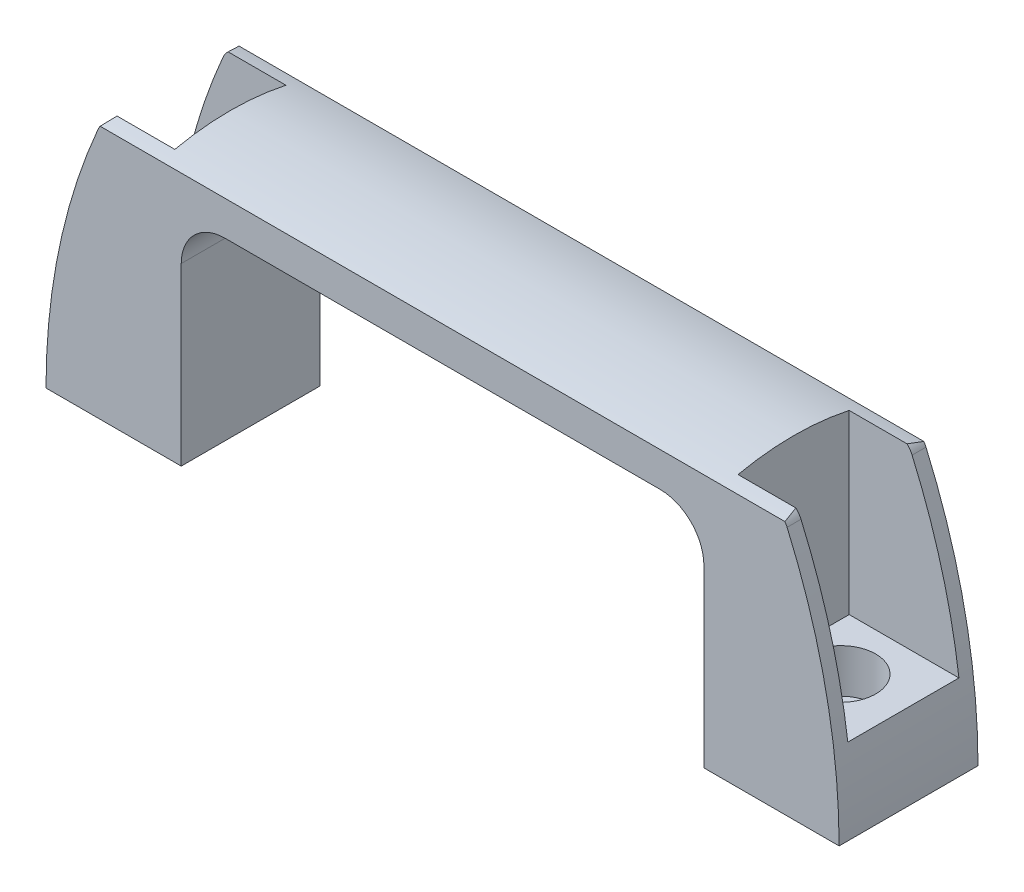
ISO-10303-21;
HEADER;
FILE_DESCRIPTION(('STEP AP214'),'2;1');
FILE_NAME('part.step','',(''),(''),'','','');
FILE_SCHEMA(('AUTOMOTIVE_DESIGN { 1 0 10303 214 1 1 1 1 }'));
ENDSEC;
DATA;
#1=APPLICATION_CONTEXT('core data for automotive mechanical design processes');
#2=APPLICATION_PROTOCOL_DEFINITION('international standard','automotive_design',2000,#1);
#3=PRODUCT_CONTEXT('',#1,'mechanical');
#4=PRODUCT('Part','Part','',(#3));
#5=PRODUCT_RELATED_PRODUCT_CATEGORY('part','',(#4));
#6=PRODUCT_DEFINITION_FORMATION('','',#4);
#7=PRODUCT_DEFINITION_CONTEXT('part definition',#1,'design');
#8=PRODUCT_DEFINITION('design','',#6,#7);
#9=PRODUCT_DEFINITION_SHAPE('','',#8);
#10=(LENGTH_UNIT() NAMED_UNIT(*) SI_UNIT(.MILLI.,.METRE.));
#11=(NAMED_UNIT(*) PLANE_ANGLE_UNIT() SI_UNIT($,.RADIAN.));
#12=(NAMED_UNIT(*) SI_UNIT($,.STERADIAN.) SOLID_ANGLE_UNIT());
#13=UNCERTAINTY_MEASURE_WITH_UNIT(LENGTH_MEASURE(1.E-05),#10,'distance_accuracy_value','');
#14=(GEOMETRIC_REPRESENTATION_CONTEXT(3) GLOBAL_UNCERTAINTY_ASSIGNED_CONTEXT((#13)) GLOBAL_UNIT_ASSIGNED_CONTEXT((#10,
#11,#12)) REPRESENTATION_CONTEXT('',''));
#15=CARTESIAN_POINT('',(0.,0.,0.));
#16=DIRECTION('',(0.,0.,1.));
#17=DIRECTION('',(1.,0.,0.));
#18=AXIS2_PLACEMENT_3D('',#15,#16,#17);
#19=CARTESIAN_POINT('',(87.25,5.,0.));
#20=DIRECTION('',(0.,1.,0.));
#21=DIRECTION('',(0.,0.,1.));
#22=AXIS2_PLACEMENT_3D('',#19,#20,#21);
#23=PLANE('',#22);
#24=CARTESIAN_POINT('',(90.,5.,0.));
#25=DIRECTION('',(0.,-1.,0.));
#26=DIRECTION('',(0.,0.,-1.));
#27=AXIS2_PLACEMENT_3D('',#24,#25,#26);
#28=CIRCLE('',#27,2.74999999999999);
#29=CARTESIAN_POINT('',(90.,5.,-2.74999999999999));
#30=VERTEX_POINT('',#29);
#31=EDGE_CURVE('E286',#30,#30,#28,.T.);
#32=ORIENTED_EDGE('',*,*,#31,.T.);
#33=EDGE_LOOP('',(#32));
#34=FACE_BOUND('',#33,.T.);
#35=CARTESIAN_POINT('',(90.,5.,0.));
#36=DIRECTION('',(0.,-1.,0.));
#37=DIRECTION('',(0.,0.,-1.));
#38=AXIS2_PLACEMENT_3D('',#35,#36,#37);
#39=CIRCLE('',#38,4.74999999999999);
#40=CARTESIAN_POINT('',(90.,5.,-4.74999999999999));
#41=VERTEX_POINT('',#40);
#42=EDGE_CURVE('E19',#41,#41,#39,.F.);
#43=ORIENTED_EDGE('',*,*,#42,.T.);
#44=EDGE_LOOP('',(#43));
#45=FACE_BOUND('',#44,.T.);
#46=ADVANCED_FACE('F16',(#34,#45),#23,.T.);
#47=CARTESIAN_POINT('',(-2.75,5.,0.));
#48=DIRECTION('',(0.,1.,0.));
#49=DIRECTION('',(0.,0.,1.));
#50=AXIS2_PLACEMENT_3D('',#47,#48,#49);
#51=PLANE('',#50);
#52=CARTESIAN_POINT('',(0.,5.,0.));
#53=DIRECTION('',(0.,-1.,0.));
#54=DIRECTION('',(0.,0.,-1.));
#55=AXIS2_PLACEMENT_3D('',#52,#53,#54);
#56=CIRCLE('',#55,2.75);
#57=CARTESIAN_POINT('',(0.,5.,-2.75));
#58=VERTEX_POINT('',#57);
#59=EDGE_CURVE('E288',#58,#58,#56,.T.);
#60=ORIENTED_EDGE('',*,*,#59,.T.);
#61=EDGE_LOOP('',(#60));
#62=FACE_BOUND('',#61,.T.);
#63=CARTESIAN_POINT('',(0.,5.,0.));
#64=DIRECTION('',(0.,-1.,0.));
#65=DIRECTION('',(0.,0.,-1.));
#66=AXIS2_PLACEMENT_3D('',#63,#64,#65);
#67=CIRCLE('',#66,4.75);
#68=CARTESIAN_POINT('',(0.,5.,-4.75));
#69=VERTEX_POINT('',#68);
#70=EDGE_CURVE('E283',#69,#69,#67,.F.);
#71=ORIENTED_EDGE('',*,*,#70,.T.);
#72=EDGE_LOOP('',(#71));
#73=FACE_BOUND('',#72,.T.);
#74=ADVANCED_FACE('F300',(#62,#73),#51,.T.);
#75=CARTESIAN_POINT('',(90.,11.,0.));
#76=DIRECTION('',(0.,-1.,0.));
#77=DIRECTION('',(0.,0.,-1.));
#78=AXIS2_PLACEMENT_3D('',#75,#76,#77);
#79=CYLINDRICAL_SURFACE('',#78,4.74999999999999);
#80=ORIENTED_EDGE('',*,*,#42,.F.);
#81=EDGE_LOOP('',(#80));
#82=FACE_BOUND('',#81,.T.);
#83=CARTESIAN_POINT('',(90.,11.,0.));
#84=DIRECTION('',(0.,-1.,0.));
#85=DIRECTION('',(0.,0.,-1.));
#86=AXIS2_PLACEMENT_3D('',#83,#84,#85);
#87=CIRCLE('',#86,4.74999999999999);
#88=CARTESIAN_POINT('',(90.,11.,-4.74999999999999));
#89=VERTEX_POINT('',#88);
#90=EDGE_CURVE('E280',#89,#89,#87,.T.);
#91=ORIENTED_EDGE('',*,*,#90,.F.);
#92=EDGE_LOOP('',(#91));
#93=FACE_BOUND('',#92,.T.);
#94=ADVANCED_FACE('F296',(#82,#93),#79,.F.);
#95=CARTESIAN_POINT('',(0.,11.,0.));
#96=DIRECTION('',(0.,-1.,0.));
#97=DIRECTION('',(0.,0.,-1.));
#98=AXIS2_PLACEMENT_3D('',#95,#96,#97);
#99=CYLINDRICAL_SURFACE('',#98,2.75);
#100=CARTESIAN_POINT('',(0.,0.,0.));
#101=DIRECTION('',(0.,-1.,0.));
#102=DIRECTION('',(0.,0.,-1.));
#103=AXIS2_PLACEMENT_3D('',#100,#101,#102);
#104=CIRCLE('',#103,2.75);
#105=CARTESIAN_POINT('',(0.,0.,-2.75));
#106=VERTEX_POINT('',#105);
#107=EDGE_CURVE('E276',#106,#106,#104,.T.);
#108=ORIENTED_EDGE('',*,*,#107,.T.);
#109=EDGE_LOOP('',(#108));
#110=FACE_BOUND('',#109,.T.);
#111=ORIENTED_EDGE('',*,*,#59,.F.);
#112=EDGE_LOOP('',(#111));
#113=FACE_BOUND('',#112,.T.);
#114=ADVANCED_FACE('F299',(#110,#113),#99,.F.);
#115=CARTESIAN_POINT('',(90.,11.,0.));
#116=DIRECTION('',(0.,-1.,0.));
#117=DIRECTION('',(0.,0.,-1.));
#118=AXIS2_PLACEMENT_3D('',#115,#116,#117);
#119=CYLINDRICAL_SURFACE('',#118,2.74999999999999);
#120=CARTESIAN_POINT('',(90.,0.,0.));
#121=DIRECTION('',(0.,-1.,0.));
#122=DIRECTION('',(0.,0.,-1.));
#123=AXIS2_PLACEMENT_3D('',#120,#121,#122);
#124=CIRCLE('',#123,2.74999999999999);
#125=CARTESIAN_POINT('',(90.,0.,-2.74999999999999));
#126=VERTEX_POINT('',#125);
#127=EDGE_CURVE('E271',#126,#126,#124,.T.);
#128=ORIENTED_EDGE('',*,*,#127,.T.);
#129=EDGE_LOOP('',(#128));
#130=FACE_BOUND('',#129,.T.);
#131=ORIENTED_EDGE('',*,*,#31,.F.);
#132=EDGE_LOOP('',(#131));
#133=FACE_BOUND('',#132,.T.);
#134=ADVANCED_FACE('F672',(#130,#133),#119,.F.);
#135=CARTESIAN_POINT('',(0.,11.,0.));
#136=DIRECTION('',(0.,-1.,0.));
#137=DIRECTION('',(0.,0.,-1.));
#138=AXIS2_PLACEMENT_3D('',#135,#136,#137);
#139=CYLINDRICAL_SURFACE('',#138,4.75);
#140=ORIENTED_EDGE('',*,*,#70,.F.);
#141=EDGE_LOOP('',(#140));
#142=FACE_BOUND('',#141,.T.);
#143=CARTESIAN_POINT('',(0.,11.,0.));
#144=DIRECTION('',(0.,-1.,0.));
#145=DIRECTION('',(0.,0.,-1.));
#146=AXIS2_PLACEMENT_3D('',#143,#144,#145);
#147=CIRCLE('',#146,4.75);
#148=CARTESIAN_POINT('',(0.,11.,-4.75));
#149=VERTEX_POINT('',#148);
#150=EDGE_CURVE('E266',#149,#149,#147,.T.);
#151=ORIENTED_EDGE('',*,*,#150,.F.);
#152=EDGE_LOOP('',(#151));
#153=FACE_BOUND('',#152,.T.);
#154=ADVANCED_FACE('F308',(#142,#153),#139,.F.);
#155=CARTESIAN_POINT('',(0.,11.,0.));
#156=DIRECTION('',(0.,1.,0.));
#157=DIRECTION('',(0.,0.,1.));
#158=AXIS2_PLACEMENT_3D('',#155,#156,#157);
#159=PLANE('',#158);
#160=ORIENTED_EDGE('',*,*,#90,.T.);
#161=EDGE_LOOP('',(#160));
#162=FACE_BOUND('',#161,.T.);
#163=DIRECTION('',(0.,0.,1.));
#164=VECTOR('',#163,1.);
#165=CARTESIAN_POINT('',(83.525,11.,7.6));
#166=LINE('',#165,#164);
#167=CARTESIAN_POINT('',(83.525,11.,-7.6));
#168=VERTEX_POINT('',#167);
#169=CARTESIAN_POINT('',(83.525,11.,7.6));
#170=VERTEX_POINT('',#169);
#171=EDGE_CURVE('E236',#168,#170,#166,.T.);
#172=ORIENTED_EDGE('',*,*,#171,.T.);
#173=DIRECTION('',(1.,0.,0.));
#174=VECTOR('',#173,1.);
#175=CARTESIAN_POINT('',(99.25,11.,7.6));
#176=LINE('',#175,#174);
#177=CARTESIAN_POINT('',(98.5415339701725,11.,7.6));
#178=VERTEX_POINT('',#177);
#179=EDGE_CURVE('E239',#170,#178,#176,.T.);
#180=ORIENTED_EDGE('',*,*,#179,.T.);
#181=DIRECTION('',(0.,0.,1.));
#182=VECTOR('',#181,1.);
#183=CARTESIAN_POINT('',(98.5415339701725,11.,9.5));
#184=LINE('',#183,#182);
#185=CARTESIAN_POINT('',(98.5415339701725,11.,-7.6));
#186=VERTEX_POINT('',#185);
#187=EDGE_CURVE('E274',#186,#178,#184,.T.);
#188=ORIENTED_EDGE('',*,*,#187,.F.);
#189=DIRECTION('',(-1.,0.,0.));
#190=VECTOR('',#189,1.);
#191=CARTESIAN_POINT('',(83.525,11.,-7.6));
#192=LINE('',#191,#190);
#193=EDGE_CURVE('E232',#186,#168,#192,.T.);
#194=ORIENTED_EDGE('',*,*,#193,.T.);
#195=EDGE_LOOP('',(#172,#180,#188,#194));
#196=FACE_BOUND('',#195,.T.);
#197=ADVANCED_FACE('F304',(#162,#196),#159,.T.);
#198=CARTESIAN_POINT('',(-9.25,0.,9.5));
#199=DIRECTION('',(0.,1.,0.));
#200=DIRECTION('',(0.,0.,1.));
#201=AXIS2_PLACEMENT_3D('',#198,#199,#200);
#202=PLANE('',#201);
#203=ORIENTED_EDGE('',*,*,#107,.F.);
#204=EDGE_LOOP('',(#203));
#205=FACE_BOUND('',#204,.T.);
#206=DIRECTION('',(0.,0.,1.));
#207=VECTOR('',#206,1.);
#208=CARTESIAN_POINT('',(9.25,0.,9.5));
#209=LINE('',#208,#207);
#210=CARTESIAN_POINT('',(9.25,0.,-9.5));
#211=VERTEX_POINT('',#210);
#212=CARTESIAN_POINT('',(9.25,0.,9.5));
#213=VERTEX_POINT('',#212);
#214=EDGE_CURVE('E279',#211,#213,#209,.T.);
#215=ORIENTED_EDGE('',*,*,#214,.T.);
#216=DIRECTION('',(1.,0.,0.));
#217=VECTOR('',#216,1.);
#218=CARTESIAN_POINT('',(76.4999999999994,0.,9.5));
#219=LINE('',#218,#217);
#220=CARTESIAN_POINT('',(-9.25000000000001,0.,9.5));
#221=VERTEX_POINT('',#220);
#222=EDGE_CURVE('E259',#221,#213,#219,.T.);
#223=ORIENTED_EDGE('',*,*,#222,.F.);
#224=DIRECTION('',(0.,0.,1.));
#225=VECTOR('',#224,1.);
#226=CARTESIAN_POINT('',(-9.25000000000001,0.,9.5));
#227=LINE('',#226,#225);
#228=CARTESIAN_POINT('',(-9.25000000000001,0.,-9.5));
#229=VERTEX_POINT('',#228);
#230=EDGE_CURVE('E364',#229,#221,#227,.T.);
#231=ORIENTED_EDGE('',*,*,#230,.F.);
#232=DIRECTION('',(1.,0.,0.));
#233=VECTOR('',#232,1.);
#234=CARTESIAN_POINT('',(76.4999999999994,0.,-9.5));
#235=LINE('',#234,#233);
#236=EDGE_CURVE('E223',#229,#211,#235,.T.);
#237=ORIENTED_EDGE('',*,*,#236,.T.);
#238=EDGE_LOOP('',(#215,#223,#231,#237));
#239=FACE_BOUND('',#238,.T.);
#240=ADVANCED_FACE('F307',(#205,#239),#202,.F.);
#241=CARTESIAN_POINT('',(9.25,0.,9.5));
#242=DIRECTION('',(-1.,0.,0.));
#243=DIRECTION('',(0.,0.,1.));
#244=AXIS2_PLACEMENT_3D('',#241,#242,#243);
#245=PLANE('',#244);
#246=DIRECTION('',(0.,0.,1.));
#247=VECTOR('',#246,1.);
#248=CARTESIAN_POINT('',(9.25,24.,9.5));
#249=LINE('',#248,#247);
#250=CARTESIAN_POINT('',(9.25,24.,-9.5));
#251=VERTEX_POINT('',#250);
#252=CARTESIAN_POINT('',(9.25,24.,9.5));
#253=VERTEX_POINT('',#252);
#254=EDGE_CURVE('E383',#251,#253,#249,.T.);
#255=ORIENTED_EDGE('',*,*,#254,.T.);
#256=DIRECTION('',(0.,1.,0.));
#257=VECTOR('',#256,1.);
#258=CARTESIAN_POINT('',(9.24999999999999,1.45716771982052E-13,9.5));
#259=LINE('',#258,#257);
#260=EDGE_CURVE('E255',#213,#253,#259,.T.);
#261=ORIENTED_EDGE('',*,*,#260,.F.);
#262=ORIENTED_EDGE('',*,*,#214,.F.);
#263=DIRECTION('',(0.,1.,0.));
#264=VECTOR('',#263,1.);
#265=CARTESIAN_POINT('',(9.24999999999999,1.45716771982052E-13,-9.5));
#266=LINE('',#265,#264);
#267=EDGE_CURVE('E219',#211,#251,#266,.T.);
#268=ORIENTED_EDGE('',*,*,#267,.T.);
#269=EDGE_LOOP('',(#255,#261,#262,#268));
#270=FACE_BOUND('',#269,.T.);
#271=ADVANCED_FACE('F525',(#270),#245,.F.);
#272=CARTESIAN_POINT('',(15.25,24.,9.5));
#273=DIRECTION('',(0.,0.,1.));
#274=DIRECTION('',(1.,0.,0.));
#275=AXIS2_PLACEMENT_3D('',#272,#273,#274);
#276=CYLINDRICAL_SURFACE('',#275,6.);
#277=DIRECTION('',(0.,0.,1.));
#278=VECTOR('',#277,1.);
#279=CARTESIAN_POINT('',(15.25,30.,9.5));
#280=LINE('',#279,#278);
#281=CARTESIAN_POINT('',(15.25,30.,-9.5));
#282=VERTEX_POINT('',#281);
#283=CARTESIAN_POINT('',(15.25,30.,9.5));
#284=VERTEX_POINT('',#283);
#285=EDGE_CURVE('E381',#282,#284,#280,.T.);
#286=ORIENTED_EDGE('',*,*,#285,.T.);
#287=CARTESIAN_POINT('',(15.25,24.,9.5));
#288=DIRECTION('',(0.,0.,1.));
#289=DIRECTION('',(1.,0.,0.));
#290=AXIS2_PLACEMENT_3D('',#287,#288,#289);
#291=CIRCLE('',#290,6.);
#292=EDGE_CURVE('E252',#253,#284,#291,.F.);
#293=ORIENTED_EDGE('',*,*,#292,.F.);
#294=ORIENTED_EDGE('',*,*,#254,.F.);
#295=CARTESIAN_POINT('',(15.25,24.,-9.5));
#296=DIRECTION('',(0.,0.,1.));
#297=DIRECTION('',(1.,0.,0.));
#298=AXIS2_PLACEMENT_3D('',#295,#296,#297);
#299=CIRCLE('',#298,6.);
#300=EDGE_CURVE('E217',#251,#282,#299,.F.);
#301=ORIENTED_EDGE('',*,*,#300,.T.);
#302=EDGE_LOOP('',(#286,#293,#294,#301));
#303=FACE_BOUND('',#302,.T.);
#304=ADVANCED_FACE('F521',(#303),#276,.F.);
#305=CARTESIAN_POINT('',(15.25,30.,9.5));
#306=DIRECTION('',(0.,1.,0.));
#307=DIRECTION('',(0.,0.,1.));
#308=AXIS2_PLACEMENT_3D('',#305,#306,#307);
#309=PLANE('',#308);
#310=DIRECTION('',(0.,0.,1.));
#311=VECTOR('',#310,1.);
#312=CARTESIAN_POINT('',(74.75,30.,9.5));
#313=LINE('',#312,#311);
#314=CARTESIAN_POINT('',(74.75,30.,-9.5));
#315=VERTEX_POINT('',#314);
#316=CARTESIAN_POINT('',(74.75,30.,9.5));
#317=VERTEX_POINT('',#316);
#318=EDGE_CURVE('E379',#315,#317,#313,.T.);
#319=ORIENTED_EDGE('',*,*,#318,.T.);
#320=DIRECTION('',(1.,0.,0.));
#321=VECTOR('',#320,1.);
#322=CARTESIAN_POINT('',(76.4999999999994,30.,9.5));
#323=LINE('',#322,#321);
#324=EDGE_CURVE('E251',#284,#317,#323,.T.);
#325=ORIENTED_EDGE('',*,*,#324,.F.);
#326=ORIENTED_EDGE('',*,*,#285,.F.);
#327=DIRECTION('',(1.,0.,0.));
#328=VECTOR('',#327,1.);
#329=CARTESIAN_POINT('',(76.4999999999994,30.,-9.5));
#330=LINE('',#329,#328);
#331=EDGE_CURVE('E216',#282,#315,#330,.T.);
#332=ORIENTED_EDGE('',*,*,#331,.T.);
#333=EDGE_LOOP('',(#319,#325,#326,#332));
#334=FACE_BOUND('',#333,.T.);
#335=ADVANCED_FACE('F517',(#334),#309,.F.);
#336=CARTESIAN_POINT('',(74.75,24.,9.5));
#337=DIRECTION('',(0.,0.,1.));
#338=DIRECTION('',(1.,0.,0.));
#339=AXIS2_PLACEMENT_3D('',#336,#337,#338);
#340=CYLINDRICAL_SURFACE('',#339,5.99999999999998);
#341=DIRECTION('',(0.,0.,-1.));
#342=VECTOR('',#341,1.);
#343=CARTESIAN_POINT('',(80.75,24.,9.5));
#344=LINE('',#343,#342);
#345=CARTESIAN_POINT('',(80.75,24.,-9.5));
#346=VERTEX_POINT('',#345);
#347=CARTESIAN_POINT('',(80.75,24.,9.5));
#348=VERTEX_POINT('',#347);
#349=EDGE_CURVE('E375',#346,#348,#344,.F.);
#350=ORIENTED_EDGE('',*,*,#349,.T.);
#351=CARTESIAN_POINT('',(74.75,24.,9.5));
#352=DIRECTION('',(0.,0.,1.));
#353=DIRECTION('',(1.,0.,0.));
#354=AXIS2_PLACEMENT_3D('',#351,#352,#353);
#355=CIRCLE('',#354,5.99999999999998);
#356=EDGE_CURVE('E247',#317,#348,#355,.F.);
#357=ORIENTED_EDGE('',*,*,#356,.F.);
#358=ORIENTED_EDGE('',*,*,#318,.F.);
#359=CARTESIAN_POINT('',(74.75,24.,-9.5));
#360=DIRECTION('',(0.,0.,1.));
#361=DIRECTION('',(1.,0.,0.));
#362=AXIS2_PLACEMENT_3D('',#359,#360,#361);
#363=CIRCLE('',#362,5.99999999999998);
#364=EDGE_CURVE('E213',#315,#346,#363,.F.);
#365=ORIENTED_EDGE('',*,*,#364,.T.);
#366=EDGE_LOOP('',(#350,#357,#358,#365));
#367=FACE_BOUND('',#366,.T.);
#368=ADVANCED_FACE('F510',(#367),#340,.F.);
#369=CARTESIAN_POINT('',(80.75,24.,9.5));
#370=DIRECTION('',(1.,0.,0.));
#371=DIRECTION('',(0.,0.,-1.));
#372=AXIS2_PLACEMENT_3D('',#369,#370,#371);
#373=PLANE('',#372);
#374=DIRECTION('',(0.,0.,1.));
#375=VECTOR('',#374,1.);
#376=CARTESIAN_POINT('',(80.75,0.,9.5));
#377=LINE('',#376,#375);
#378=CARTESIAN_POINT('',(80.75,0.,-9.5));
#379=VERTEX_POINT('',#378);
#380=CARTESIAN_POINT('',(80.75,0.,9.5));
#381=VERTEX_POINT('',#380);
#382=EDGE_CURVE('E275',#379,#381,#377,.T.);
#383=ORIENTED_EDGE('',*,*,#382,.T.);
#384=DIRECTION('',(0.,1.,0.));
#385=VECTOR('',#384,1.);
#386=CARTESIAN_POINT('',(80.75,1.45716771982052E-13,9.5));
#387=LINE('',#386,#385);
#388=EDGE_CURVE('E250',#348,#381,#387,.F.);
#389=ORIENTED_EDGE('',*,*,#388,.F.);
#390=ORIENTED_EDGE('',*,*,#349,.F.);
#391=DIRECTION('',(0.,1.,0.));
#392=VECTOR('',#391,1.);
#393=CARTESIAN_POINT('',(80.75,1.45716771982052E-13,-9.5));
#394=LINE('',#393,#392);
#395=EDGE_CURVE('E215',#346,#379,#394,.F.);
#396=ORIENTED_EDGE('',*,*,#395,.T.);
#397=EDGE_LOOP('',(#383,#389,#390,#396));
#398=FACE_BOUND('',#397,.T.);
#399=ADVANCED_FACE('F506',(#398),#373,.F.);
#400=CARTESIAN_POINT('',(80.75,0.,9.5));
#401=DIRECTION('',(0.,1.,0.));
#402=DIRECTION('',(0.,0.,1.));
#403=AXIS2_PLACEMENT_3D('',#400,#401,#402);
#404=PLANE('',#403);
#405=ORIENTED_EDGE('',*,*,#127,.F.);
#406=EDGE_LOOP('',(#405));
#407=FACE_BOUND('',#406,.T.);
#408=DIRECTION('',(0.,0.,1.));
#409=VECTOR('',#408,1.);
#410=CARTESIAN_POINT('',(99.25,-1.2490009027033E-13,9.5));
#411=LINE('',#410,#409);
#412=CARTESIAN_POINT('',(99.25,0.,9.5));
#413=VERTEX_POINT('',#412);
#414=CARTESIAN_POINT('',(99.25,0.,-9.5));
#415=VERTEX_POINT('',#414);
#416=EDGE_CURVE('E270',#413,#415,#411,.F.);
#417=ORIENTED_EDGE('',*,*,#416,.F.);
#418=DIRECTION('',(1.,0.,0.));
#419=VECTOR('',#418,1.);
#420=CARTESIAN_POINT('',(76.4999999999994,0.,9.5));
#421=LINE('',#420,#419);
#422=EDGE_CURVE('E246',#381,#413,#421,.T.);
#423=ORIENTED_EDGE('',*,*,#422,.F.);
#424=ORIENTED_EDGE('',*,*,#382,.F.);
#425=DIRECTION('',(1.,0.,0.));
#426=VECTOR('',#425,1.);
#427=CARTESIAN_POINT('',(76.4999999999994,0.,-9.5));
#428=LINE('',#427,#426);
#429=EDGE_CURVE('E212',#379,#415,#428,.T.);
#430=ORIENTED_EDGE('',*,*,#429,.T.);
#431=EDGE_LOOP('',(#417,#423,#424,#430));
#432=FACE_BOUND('',#431,.T.);
#433=ADVANCED_FACE('F502',(#407,#432),#404,.F.);
#434=CARTESIAN_POINT('',(13.4999999999993,-1.2490009027033E-13,9.5));
#435=DIRECTION('',(0.,0.,1.));
#436=DIRECTION('',(1.,0.,0.));
#437=AXIS2_PLACEMENT_3D('',#434,#435,#436);
#438=CYLINDRICAL_SURFACE('',#437,85.7500000000007);
#439=ORIENTED_EDGE('',*,*,#416,.T.);
#440=CARTESIAN_POINT('',(13.4999999999993,-1.2490009027033E-13,-9.5));
#441=DIRECTION('',(0.,0.,1.));
#442=DIRECTION('',(1.,0.,0.));
#443=AXIS2_PLACEMENT_3D('',#440,#441,#442);
#444=CIRCLE('',#443,85.7500000000007);
#445=CARTESIAN_POINT('',(92.1363177080887,34.1963746223565,-9.5));
#446=VERTEX_POINT('',#445);
#447=EDGE_CURVE('E210',#415,#446,#444,.T.);
#448=ORIENTED_EDGE('',*,*,#447,.T.);
#449=DIRECTION('',(0.,0.,1.));
#450=VECTOR('',#449,1.);
#451=CARTESIAN_POINT('',(92.1363177080887,34.1963746223565,9.5));
#452=LINE('',#451,#450);
#453=CARTESIAN_POINT('',(92.1363177080887,34.1963746223565,-7.6));
#454=VERTEX_POINT('',#453);
#455=EDGE_CURVE('E224',#454,#446,#452,.F.);
#456=ORIENTED_EDGE('',*,*,#455,.F.);
#457=CARTESIAN_POINT('',(13.4999999999993,-1.2490009027033E-13,-7.6));
#458=DIRECTION('',(0.,0.,1.));
#459=DIRECTION('',(1.,0.,0.));
#460=AXIS2_PLACEMENT_3D('',#457,#458,#459);
#461=CIRCLE('',#460,85.7500000000007);
#462=EDGE_CURVE('E229',#454,#186,#461,.F.);
#463=ORIENTED_EDGE('',*,*,#462,.T.);
#464=ORIENTED_EDGE('',*,*,#187,.T.);
#465=CARTESIAN_POINT('',(13.4999999999993,-1.2490009027033E-13,7.6));
#466=DIRECTION('',(0.,0.,1.));
#467=DIRECTION('',(1.,0.,0.));
#468=AXIS2_PLACEMENT_3D('',#465,#466,#467);
#469=CIRCLE('',#468,85.7500000000007);
#470=CARTESIAN_POINT('',(92.1363177080887,34.1963746223565,7.6));
#471=VERTEX_POINT('',#470);
#472=EDGE_CURVE('E237',#178,#471,#469,.T.);
#473=ORIENTED_EDGE('',*,*,#472,.T.);
#474=DIRECTION('',(0.,0.,1.));
#475=VECTOR('',#474,1.);
#476=CARTESIAN_POINT('',(92.1363177080887,34.1963746223565,9.5));
#477=LINE('',#476,#475);
#478=CARTESIAN_POINT('',(92.1363177080887,34.1963746223565,9.50000000000001));
#479=VERTEX_POINT('',#478);
#480=EDGE_CURVE('E243',#479,#471,#477,.F.);
#481=ORIENTED_EDGE('',*,*,#480,.F.);
#482=CARTESIAN_POINT('',(13.4999999999993,-1.2490009027033E-13,9.5));
#483=DIRECTION('',(0.,0.,1.));
#484=DIRECTION('',(1.,0.,0.));
#485=AXIS2_PLACEMENT_3D('',#482,#483,#484);
#486=CIRCLE('',#485,85.7500000000007);
#487=EDGE_CURVE('E244',#413,#479,#486,.T.);
#488=ORIENTED_EDGE('',*,*,#487,.F.);
#489=EDGE_LOOP('',(#439,#448,#456,#463,#464,#473,#481,#488));
#490=FACE_BOUND('',#489,.T.);
#491=ADVANCED_FACE('F496',(#490),#438,.T.);
#492=CARTESIAN_POINT('',(0.,11.,0.));
#493=DIRECTION('',(0.,1.,0.));
#494=DIRECTION('',(0.,0.,1.));
#495=AXIS2_PLACEMENT_3D('',#492,#493,#494);
#496=PLANE('',#495);
#497=ORIENTED_EDGE('',*,*,#150,.T.);
#498=EDGE_LOOP('',(#497));
#499=FACE_BOUND('',#498,.T.);
#500=DIRECTION('',(0.,0.,-1.));
#501=VECTOR('',#500,1.);
#502=CARTESIAN_POINT('',(6.47499999999999,11.,-7.6));
#503=LINE('',#502,#501);
#504=CARTESIAN_POINT('',(6.47499999999999,11.,7.6));
#505=VERTEX_POINT('',#504);
#506=CARTESIAN_POINT('',(6.47499999999999,11.,-7.6));
#507=VERTEX_POINT('',#506);
#508=EDGE_CURVE('E175',#505,#507,#503,.T.);
#509=ORIENTED_EDGE('',*,*,#508,.T.);
#510=DIRECTION('',(-1.,0.,0.));
#511=VECTOR('',#510,1.);
#512=CARTESIAN_POINT('',(-9.25,11.,-7.6));
#513=LINE('',#512,#511);
#514=CARTESIAN_POINT('',(-8.5415339701725,11.,-7.6));
#515=VERTEX_POINT('',#514);
#516=EDGE_CURVE('E203',#507,#515,#513,.T.);
#517=ORIENTED_EDGE('',*,*,#516,.T.);
#518=DIRECTION('',(0.,0.,1.));
#519=VECTOR('',#518,1.);
#520=CARTESIAN_POINT('',(-8.5415339701725,11.,9.5));
#521=LINE('',#520,#519);
#522=CARTESIAN_POINT('',(-8.5415339701725,11.,7.6));
#523=VERTEX_POINT('',#522);
#524=EDGE_CURVE('E269',#523,#515,#521,.F.);
#525=ORIENTED_EDGE('',*,*,#524,.F.);
#526=DIRECTION('',(1.,0.,0.));
#527=VECTOR('',#526,1.);
#528=CARTESIAN_POINT('',(6.47499999999999,11.,7.6));
#529=LINE('',#528,#527);
#530=EDGE_CURVE('E148',#523,#505,#529,.T.);
#531=ORIENTED_EDGE('',*,*,#530,.T.);
#532=EDGE_LOOP('',(#509,#517,#525,#531));
#533=FACE_BOUND('',#532,.T.);
#534=ADVANCED_FACE('F485',(#499,#533),#496,.T.);
#535=CARTESIAN_POINT('',(76.4999999999994,1.45716771982052E-13,9.5));
#536=DIRECTION('',(0.,0.,1.));
#537=DIRECTION('',(1.,0.,0.));
#538=AXIS2_PLACEMENT_3D('',#535,#536,#537);
#539=CYLINDRICAL_SURFACE('',#538,85.7499999999994);
#540=ORIENTED_EDGE('',*,*,#230,.T.);
#541=CARTESIAN_POINT('',(76.4999999999994,1.45716771982052E-13,9.5));
#542=DIRECTION('',(0.,0.,1.));
#543=DIRECTION('',(1.,0.,0.));
#544=AXIS2_PLACEMENT_3D('',#541,#542,#543);
#545=CIRCLE('',#544,85.7499999999994);
#546=CARTESIAN_POINT('',(-2.13631770808863,34.1963746223565,9.5));
#547=VERTEX_POINT('',#546);
#548=EDGE_CURVE('E256',#547,#221,#545,.T.);
#549=ORIENTED_EDGE('',*,*,#548,.F.);
#550=DIRECTION('',(0.,0.,1.));
#551=VECTOR('',#550,1.);
#552=CARTESIAN_POINT('',(-2.13631770808863,34.1963746223565,9.5));
#553=LINE('',#552,#551);
#554=CARTESIAN_POINT('',(-2.13631770808863,34.1963746223565,7.6));
#555=VERTEX_POINT('',#554);
#556=EDGE_CURVE('E263',#555,#547,#553,.T.);
#557=ORIENTED_EDGE('',*,*,#556,.F.);
#558=CARTESIAN_POINT('',(76.4999999999994,1.45716771982052E-13,7.6));
#559=DIRECTION('',(0.,0.,1.));
#560=DIRECTION('',(1.,0.,0.));
#561=AXIS2_PLACEMENT_3D('',#558,#559,#560);
#562=CIRCLE('',#561,85.7499999999994);
#563=EDGE_CURVE('E141',#555,#523,#562,.T.);
#564=ORIENTED_EDGE('',*,*,#563,.T.);
#565=ORIENTED_EDGE('',*,*,#524,.T.);
#566=CARTESIAN_POINT('',(76.4999999999994,1.45716771982052E-13,-7.6));
#567=DIRECTION('',(0.,0.,1.));
#568=DIRECTION('',(1.,0.,0.));
#569=AXIS2_PLACEMENT_3D('',#566,#567,#568);
#570=CIRCLE('',#569,85.7499999999994);
#571=CARTESIAN_POINT('',(-2.13631770808863,34.1963746223565,-7.6));
#572=VERTEX_POINT('',#571);
#573=EDGE_CURVE('E201',#515,#572,#570,.F.);
#574=ORIENTED_EDGE('',*,*,#573,.T.);
#575=DIRECTION('',(0.,0.,1.));
#576=VECTOR('',#575,1.);
#577=CARTESIAN_POINT('',(-2.13631770808863,34.1963746223565,9.5));
#578=LINE('',#577,#576);
#579=CARTESIAN_POINT('',(-2.13631770808863,34.1963746223565,-9.5));
#580=VERTEX_POINT('',#579);
#581=EDGE_CURVE('E207',#580,#572,#578,.T.);
#582=ORIENTED_EDGE('',*,*,#581,.F.);
#583=CARTESIAN_POINT('',(76.4999999999994,1.45716771982052E-13,-9.5));
#584=DIRECTION('',(0.,0.,1.));
#585=DIRECTION('',(1.,0.,0.));
#586=AXIS2_PLACEMENT_3D('',#583,#584,#585);
#587=CIRCLE('',#586,85.7499999999994);
#588=EDGE_CURVE('E220',#580,#229,#587,.T.);
#589=ORIENTED_EDGE('',*,*,#588,.T.);
#590=EDGE_LOOP('',(#540,#549,#557,#564,#565,#574,#582,#589));
#591=FACE_BOUND('',#590,.T.);
#592=ADVANCED_FACE('F486',(#591),#539,.T.);
#593=CARTESIAN_POINT('',(6.47499999999999,56.,-7.6));
#594=DIRECTION('',(1.,0.,0.));
#595=DIRECTION('',(0.,0.,-1.));
#596=AXIS2_PLACEMENT_3D('',#593,#594,#595);
#597=PLANE('',#596);
#598=CARTESIAN_POINT('',(6.47499999999999,-1.11022302462516E-13,0.));
#599=DIRECTION('',(1.,0.,0.));
#600=DIRECTION('',(0.,0.,-1.));
#601=AXIS2_PLACEMENT_3D('',#598,#599,#600);
#602=CIRCLE('',#601,36.0000000000001);
#603=CARTESIAN_POINT('',(6.47499999999999,35.1886345287793,-7.6));
#604=VERTEX_POINT('',#603);
#605=CARTESIAN_POINT('',(6.47499999999999,35.1886345287793,7.6));
#606=VERTEX_POINT('',#605);
#607=EDGE_CURVE('E169',#604,#606,#602,.T.);
#608=ORIENTED_EDGE('',*,*,#607,.F.);
#609=DIRECTION('',(0.,1.,0.));
#610=VECTOR('',#609,1.);
#611=CARTESIAN_POINT('',(6.47499999999999,56.,-7.6));
#612=LINE('',#611,#610);
#613=EDGE_CURVE('E189',#604,#507,#612,.F.);
#614=ORIENTED_EDGE('',*,*,#613,.T.);
#615=ORIENTED_EDGE('',*,*,#508,.F.);
#616=DIRECTION('',(0.,1.,0.));
#617=VECTOR('',#616,1.);
#618=CARTESIAN_POINT('',(6.47499999999999,56.,7.6));
#619=LINE('',#618,#617);
#620=EDGE_CURVE('E172',#505,#606,#619,.T.);
#621=ORIENTED_EDGE('',*,*,#620,.T.);
#622=EDGE_LOOP('',(#608,#614,#615,#621));
#623=FACE_BOUND('',#622,.T.);
#624=ADVANCED_FACE('F174',(#623),#597,.F.);
#625=CARTESIAN_POINT('',(6.47499999999999,56.,7.6));
#626=DIRECTION('',(0.,0.,1.));
#627=DIRECTION('',(1.,0.,0.));
#628=AXIS2_PLACEMENT_3D('',#625,#626,#627);
#629=PLANE('',#628);
#630=DIRECTION('',(1.,0.,0.));
#631=VECTOR('',#630,1.);
#632=CARTESIAN_POINT('',(99.25,35.1886345287793,7.6));
#633=LINE('',#632,#631);
#634=CARTESIAN_POINT('',(-1.43699183256702,35.1886345287793,7.6));
#635=VERTEX_POINT('',#634);
#636=EDGE_CURVE('E179',#606,#635,#633,.F.);
#637=ORIENTED_EDGE('',*,*,#636,.F.);
#638=ORIENTED_EDGE('',*,*,#620,.F.);
#639=ORIENTED_EDGE('',*,*,#530,.F.);
#640=ORIENTED_EDGE('',*,*,#563,.F.);
#641=CARTESIAN_POINT('',(0.614807109687067,33.,7.6));
#642=DIRECTION('',(0.,0.,1.));
#643=DIRECTION('',(1.,0.,0.));
#644=AXIS2_PLACEMENT_3D('',#641,#642,#643);
#645=CIRCLE('',#644,3.);
#646=EDGE_CURVE('E176',#635,#555,#645,.T.);
#647=ORIENTED_EDGE('',*,*,#646,.F.);
#648=EDGE_LOOP('',(#637,#638,#639,#640,#647));
#649=FACE_BOUND('',#648,.T.);
#650=ADVANCED_FACE('F180',(#649),#629,.F.);
#651=CARTESIAN_POINT('',(0.614807109687067,33.,9.5));
#652=DIRECTION('',(0.,0.,1.));
#653=DIRECTION('',(1.,0.,0.));
#654=AXIS2_PLACEMENT_3D('',#651,#652,#653);
#655=CYLINDRICAL_SURFACE('',#654,3.);
#656=ORIENTED_EDGE('',*,*,#646,.T.);
#657=ORIENTED_EDGE('',*,*,#556,.T.);
#658=CARTESIAN_POINT('',(0.614807109687067,33.,9.5));
#659=DIRECTION('',(0.,0.,1.));
#660=DIRECTION('',(1.,0.,0.));
#661=AXIS2_PLACEMENT_3D('',#658,#659,#660);
#662=CIRCLE('',#661,3.);
#663=CARTESIAN_POINT('',(-1.8404180577051,34.7239110700393,9.50000000000001));
#664=VERTEX_POINT('',#663);
#665=EDGE_CURVE('E260',#664,#547,#662,.T.);
#666=ORIENTED_EDGE('',*,*,#665,.F.);
#667=CARTESIAN_POINT('',(-1.43699183256702,35.1886345287793,7.6));
#668=CARTESIAN_POINT('',(-1.47356508990325,35.1543467369328,7.75875509625639));
#669=CARTESIAN_POINT('',(-1.50948273688143,35.1189532735742,7.91742366683796));
#670=CARTESIAN_POINT('',(-1.57987598925391,35.0459564127749,8.23452509199082));
#671=CARTESIAN_POINT('',(-1.61435197898989,35.0083536108504,8.39295799838589));
#672=CARTESIAN_POINT('',(-1.68175098711074,34.9309209362097,8.70961127733847));
#673=CARTESIAN_POINT('',(-1.71467399930432,34.8910910546162,8.86783164904623));
#674=CARTESIAN_POINT('',(-1.77884139230846,34.8091855130233,9.18407812239828));
#675=CARTESIAN_POINT('',(-1.81008532015692,34.7671092530662,9.34210416049499));
#676=CARTESIAN_POINT('',(-1.8404180577051,34.7239110700393,9.50000000000001));
#677=B_SPLINE_CURVE_WITH_KNOTS('',3,(#667,#668,#669,#670,#671,#672,#673,#674,#675,#676),
.UNSPECIFIED.,.F.,.F.,(4,2,2,2,4),(0.,0.49944434029429,0.998754670035894,1.49806699022215,
1.99751333929284),.UNSPECIFIED.);
#678=EDGE_CURVE('E185',#635,#664,#677,.T.);
#679=ORIENTED_EDGE('',*,*,#678,.F.);
#680=EDGE_LOOP('',(#656,#657,#666,#679));
#681=FACE_BOUND('',#680,.T.);
#682=ADVANCED_FACE('F489',(#681),#655,.T.);
#683=CARTESIAN_POINT('',(76.4999999999994,1.45716771982052E-13,9.5));
#684=DIRECTION('',(0.,0.,1.));
#685=DIRECTION('',(1.,0.,0.));
#686=AXIS2_PLACEMENT_3D('',#683,#684,#685);
#687=PLANE('',#686);
#688=ORIENTED_EDGE('',*,*,#487,.T.);
#689=CARTESIAN_POINT('',(89.385192890313,33.,9.50000000000001));
#690=DIRECTION('',(0.,0.,1.));
#691=DIRECTION('',(1.,0.,0.));
#692=AXIS2_PLACEMENT_3D('',#689,#690,#691);
#693=CIRCLE('',#692,2.99999999999999);
#694=CARTESIAN_POINT('',(91.8404180577051,34.7239110700393,9.50000000000001));
#695=VERTEX_POINT('',#694);
#696=EDGE_CURVE('E240',#695,#479,#693,.F.);
#697=ORIENTED_EDGE('',*,*,#696,.F.);
#698=DIRECTION('',(1.,0.,0.));
#699=VECTOR('',#698,1.);
#700=CARTESIAN_POINT('',(99.25,34.7239110700393,9.50000000000002));
#701=LINE('',#700,#699);
#702=EDGE_CURVE('E442',#664,#695,#701,.T.);
#703=ORIENTED_EDGE('',*,*,#702,.F.);
#704=ORIENTED_EDGE('',*,*,#665,.T.);
#705=ORIENTED_EDGE('',*,*,#548,.T.);
#706=ORIENTED_EDGE('',*,*,#222,.T.);
#707=ORIENTED_EDGE('',*,*,#260,.T.);
#708=ORIENTED_EDGE('',*,*,#292,.T.);
#709=ORIENTED_EDGE('',*,*,#324,.T.);
#710=ORIENTED_EDGE('',*,*,#356,.T.);
#711=ORIENTED_EDGE('',*,*,#388,.T.);
#712=ORIENTED_EDGE('',*,*,#422,.T.);
#713=EDGE_LOOP('',(#688,#697,#703,#704,#705,#706,#707,#708,#709,#710,#711,#712));
#714=FACE_BOUND('',#713,.T.);
#715=ADVANCED_FACE('F434',(#714),#687,.T.);
#716=CARTESIAN_POINT('',(89.385192890313,33.,9.5));
#717=DIRECTION('',(0.,0.,1.));
#718=DIRECTION('',(1.,0.,0.));
#719=AXIS2_PLACEMENT_3D('',#716,#717,#718);
#720=CYLINDRICAL_SURFACE('',#719,2.99999999999999);
#721=ORIENTED_EDGE('',*,*,#696,.T.);
#722=ORIENTED_EDGE('',*,*,#480,.T.);
#723=CARTESIAN_POINT('',(89.385192890313,33.,7.6));
#724=DIRECTION('',(0.,0.,1.));
#725=DIRECTION('',(1.,0.,0.));
#726=AXIS2_PLACEMENT_3D('',#723,#724,#725);
#727=CIRCLE('',#726,2.99999999999999);
#728=CARTESIAN_POINT('',(91.436991832567,35.1886345287793,7.6));
#729=VERTEX_POINT('',#728);
#730=EDGE_CURVE('E234',#471,#729,#727,.T.);
#731=ORIENTED_EDGE('',*,*,#730,.T.);
#732=CARTESIAN_POINT('',(91.8404180577051,34.7239110700393,9.50000000000001));
#733=CARTESIAN_POINT('',(91.810085320157,34.7671092530662,9.34210416049498));
#734=CARTESIAN_POINT('',(91.7788413923085,34.8091855130233,9.18407812239827));
#735=CARTESIAN_POINT('',(91.7146739993044,34.8910910546162,8.86783164904622));
#736=CARTESIAN_POINT('',(91.6817509871108,34.9309209362097,8.70961127733846));
#737=CARTESIAN_POINT('',(91.6143519789899,35.0083536108504,8.39295799838588));
#738=CARTESIAN_POINT('',(91.5798759892539,35.0459564127749,8.23452509199081));
#739=CARTESIAN_POINT('',(91.5094827368815,35.1189532735742,7.91742366683794));
#740=CARTESIAN_POINT('',(91.4735650899033,35.1543467369328,7.75875509625637));
#741=CARTESIAN_POINT('',(91.436991832567,35.1886345287793,7.59999999999998));
#742=B_SPLINE_CURVE_WITH_KNOTS('',3,(#732,#733,#734,#735,#736,#737,#738,#739,#740,#741),
.UNSPECIFIED.,.F.,.F.,(4,2,2,2,4),(0.,0.499446349070695,0.998758669256955,1.49806899899856,
1.99751333929286),.UNSPECIFIED.);
#743=EDGE_CURVE('E436',#695,#729,#742,.T.);
#744=ORIENTED_EDGE('',*,*,#743,.F.);
#745=EDGE_LOOP('',(#721,#722,#731,#744));
#746=FACE_BOUND('',#745,.T.);
#747=ADVANCED_FACE('F430',(#746),#720,.T.);
#748=CARTESIAN_POINT('',(99.25,56.,7.6));
#749=DIRECTION('',(0.,0.,1.));
#750=DIRECTION('',(1.,0.,0.));
#751=AXIS2_PLACEMENT_3D('',#748,#749,#750);
#752=PLANE('',#751);
#753=DIRECTION('',(1.,0.,0.));
#754=VECTOR('',#753,1.);
#755=CARTESIAN_POINT('',(99.25,35.1886345287793,7.6));
#756=LINE('',#755,#754);
#757=CARTESIAN_POINT('',(83.525,35.1886345287793,7.6));
#758=VERTEX_POINT('',#757);
#759=EDGE_CURVE('E441',#729,#758,#756,.F.);
#760=ORIENTED_EDGE('',*,*,#759,.F.);
#761=ORIENTED_EDGE('',*,*,#730,.F.);
#762=ORIENTED_EDGE('',*,*,#472,.F.);
#763=ORIENTED_EDGE('',*,*,#179,.F.);
#764=DIRECTION('',(0.,1.,0.));
#765=VECTOR('',#764,1.);
#766=CARTESIAN_POINT('',(83.525,56.,7.6));
#767=LINE('',#766,#765);
#768=EDGE_CURVE('E233',#170,#758,#767,.T.);
#769=ORIENTED_EDGE('',*,*,#768,.T.);
#770=EDGE_LOOP('',(#760,#761,#762,#763,#769));
#771=FACE_BOUND('',#770,.T.);
#772=ADVANCED_FACE('F323',(#771),#752,.F.);
#773=CARTESIAN_POINT('',(83.525,56.,7.6));
#774=DIRECTION('',(-1.,0.,0.));
#775=DIRECTION('',(0.,0.,1.));
#776=AXIS2_PLACEMENT_3D('',#773,#774,#775);
#777=PLANE('',#776);
#778=CARTESIAN_POINT('',(83.525,-1.11022302462516E-13,0.));
#779=DIRECTION('',(1.,0.,0.));
#780=DIRECTION('',(0.,0.,-1.));
#781=AXIS2_PLACEMENT_3D('',#778,#779,#780);
#782=CIRCLE('',#781,36.0000000000001);
#783=CARTESIAN_POINT('',(83.525,35.1886345287793,-7.6));
#784=VERTEX_POINT('',#783);
#785=EDGE_CURVE('E329',#758,#784,#782,.F.);
#786=ORIENTED_EDGE('',*,*,#785,.F.);
#787=ORIENTED_EDGE('',*,*,#768,.F.);
#788=ORIENTED_EDGE('',*,*,#171,.F.);
#789=DIRECTION('',(0.,1.,0.));
#790=VECTOR('',#789,1.);
#791=CARTESIAN_POINT('',(83.525,56.,-7.6));
#792=LINE('',#791,#790);
#793=EDGE_CURVE('E228',#168,#784,#792,.T.);
#794=ORIENTED_EDGE('',*,*,#793,.T.);
#795=EDGE_LOOP('',(#786,#787,#788,#794));
#796=FACE_BOUND('',#795,.T.);
#797=ADVANCED_FACE('F327',(#796),#777,.F.);
#798=CARTESIAN_POINT('',(83.525,56.,-7.6));
#799=DIRECTION('',(0.,0.,-1.));
#800=DIRECTION('',(-1.,0.,0.));
#801=AXIS2_PLACEMENT_3D('',#798,#799,#800);
#802=PLANE('',#801);
#803=DIRECTION('',(1.,0.,0.));
#804=VECTOR('',#803,1.);
#805=CARTESIAN_POINT('',(99.25,35.1886345287793,-7.60000000000001));
#806=LINE('',#805,#804);
#807=CARTESIAN_POINT('',(91.436991832567,35.1886345287793,-7.6));
#808=VERTEX_POINT('',#807);
#809=EDGE_CURVE('E443',#784,#808,#806,.T.);
#810=ORIENTED_EDGE('',*,*,#809,.F.);
#811=ORIENTED_EDGE('',*,*,#793,.F.);
#812=ORIENTED_EDGE('',*,*,#193,.F.);
#813=ORIENTED_EDGE('',*,*,#462,.F.);
#814=CARTESIAN_POINT('',(89.385192890313,33.,-7.6));
#815=DIRECTION('',(0.,0.,1.));
#816=DIRECTION('',(1.,0.,0.));
#817=AXIS2_PLACEMENT_3D('',#814,#815,#816);
#818=CIRCLE('',#817,2.99999999999999);
#819=EDGE_CURVE('E225',#808,#454,#818,.F.);
#820=ORIENTED_EDGE('',*,*,#819,.F.);
#821=EDGE_LOOP('',(#810,#811,#812,#813,#820));
#822=FACE_BOUND('',#821,.T.);
#823=ADVANCED_FACE('F421',(#822),#802,.F.);
#824=CARTESIAN_POINT('',(89.385192890313,33.,9.5));
#825=DIRECTION('',(0.,0.,1.));
#826=DIRECTION('',(1.,0.,0.));
#827=AXIS2_PLACEMENT_3D('',#824,#825,#826);
#828=CYLINDRICAL_SURFACE('',#827,2.99999999999999);
#829=ORIENTED_EDGE('',*,*,#819,.T.);
#830=ORIENTED_EDGE('',*,*,#455,.T.);
#831=CARTESIAN_POINT('',(89.385192890313,33.,-9.5));
#832=DIRECTION('',(0.,0.,1.));
#833=DIRECTION('',(1.,0.,0.));
#834=AXIS2_PLACEMENT_3D('',#831,#832,#833);
#835=CIRCLE('',#834,2.99999999999999);
#836=CARTESIAN_POINT('',(91.8404180577051,34.7239110700393,-9.50000000000001));
#837=VERTEX_POINT('',#836);
#838=EDGE_CURVE('E208',#446,#837,#835,.T.);
#839=ORIENTED_EDGE('',*,*,#838,.T.);
#840=CARTESIAN_POINT('',(91.436991832567,35.1886345287793,-7.59999999999999));
#841=CARTESIAN_POINT('',(91.4735650899033,35.1543467369328,-7.75875509625638));
#842=CARTESIAN_POINT('',(91.5094827368815,35.1189532735742,-7.91742366683795));
#843=CARTESIAN_POINT('',(91.5798759892539,35.0459564127749,-8.23452509199081));
#844=CARTESIAN_POINT('',(91.6143519789899,35.0083536108504,-8.39295799838588));
#845=CARTESIAN_POINT('',(91.6817509871108,34.9309209362097,-8.70961127733847));
#846=CARTESIAN_POINT('',(91.7146739993044,34.8910910546162,-8.86783164904622));
#847=CARTESIAN_POINT('',(91.7788413923085,34.8091855130233,-9.18407812239826));
#848=CARTESIAN_POINT('',(91.810085320157,34.7671092530662,-9.34210416049498));
#849=CARTESIAN_POINT('',(91.8404180577051,34.7239110700393,-9.5));
#850=B_SPLINE_CURVE_WITH_KNOTS('',3,(#840,#841,#842,#843,#844,#845,#846,#847,#848,#849),
.UNSPECIFIED.,.F.,.F.,(4,2,2,2,4),(0.,0.49944434029429,0.998754670035895,1.49806699022215,
1.99751333929284),.UNSPECIFIED.);
#851=EDGE_CURVE('E401',#808,#837,#850,.T.);
#852=ORIENTED_EDGE('',*,*,#851,.F.);
#853=EDGE_LOOP('',(#829,#830,#839,#852));
#854=FACE_BOUND('',#853,.T.);
#855=ADVANCED_FACE('F416',(#854),#828,.T.);
#856=CARTESIAN_POINT('',(76.4999999999994,1.45716771982052E-13,-9.5));
#857=DIRECTION('',(0.,0.,1.));
#858=DIRECTION('',(1.,0.,0.));
#859=AXIS2_PLACEMENT_3D('',#856,#857,#858);
#860=PLANE('',#859);
#861=DIRECTION('',(1.,0.,0.));
#862=VECTOR('',#861,1.);
#863=CARTESIAN_POINT('',(99.25,34.7239110700393,-9.50000000000001));
#864=LINE('',#863,#862);
#865=CARTESIAN_POINT('',(-1.8404180577051,34.7239110700393,-9.5));
#866=VERTEX_POINT('',#865);
#867=EDGE_CURVE('E400',#837,#866,#864,.F.);
#868=ORIENTED_EDGE('',*,*,#867,.F.);
#869=ORIENTED_EDGE('',*,*,#838,.F.);
#870=ORIENTED_EDGE('',*,*,#447,.F.);
#871=ORIENTED_EDGE('',*,*,#429,.F.);
#872=ORIENTED_EDGE('',*,*,#395,.F.);
#873=ORIENTED_EDGE('',*,*,#364,.F.);
#874=ORIENTED_EDGE('',*,*,#331,.F.);
#875=ORIENTED_EDGE('',*,*,#300,.F.);
#876=ORIENTED_EDGE('',*,*,#267,.F.);
#877=ORIENTED_EDGE('',*,*,#236,.F.);
#878=ORIENTED_EDGE('',*,*,#588,.F.);
#879=CARTESIAN_POINT('',(0.614807109687067,33.,-9.5));
#880=DIRECTION('',(0.,0.,1.));
#881=DIRECTION('',(1.,0.,0.));
#882=AXIS2_PLACEMENT_3D('',#879,#880,#881);
#883=CIRCLE('',#882,3.);
#884=EDGE_CURVE('E204',#866,#580,#883,.T.);
#885=ORIENTED_EDGE('',*,*,#884,.F.);
#886=EDGE_LOOP('',(#868,#869,#870,#871,#872,#873,#874,#875,#876,#877,#878,#885));
#887=FACE_BOUND('',#886,.T.);
#888=ADVANCED_FACE('F414',(#887),#860,.F.);
#889=CARTESIAN_POINT('',(0.614807109687067,33.,9.5));
#890=DIRECTION('',(0.,0.,1.));
#891=DIRECTION('',(1.,0.,0.));
#892=AXIS2_PLACEMENT_3D('',#889,#890,#891);
#893=CYLINDRICAL_SURFACE('',#892,3.);
#894=ORIENTED_EDGE('',*,*,#884,.T.);
#895=ORIENTED_EDGE('',*,*,#581,.T.);
#896=CARTESIAN_POINT('',(0.614807109687067,33.,-7.6));
#897=DIRECTION('',(0.,0.,1.));
#898=DIRECTION('',(1.,0.,0.));
#899=AXIS2_PLACEMENT_3D('',#896,#897,#898);
#900=CIRCLE('',#899,3.);
#901=CARTESIAN_POINT('',(-1.43699183256702,35.1886345287793,-7.6));
#902=VERTEX_POINT('',#901);
#903=EDGE_CURVE('E34',#572,#902,#900,.F.);
#904=ORIENTED_EDGE('',*,*,#903,.T.);
#905=CARTESIAN_POINT('',(-1.8404180577051,34.7239110700393,-9.50000000000001));
#906=CARTESIAN_POINT('',(-1.81008532015692,34.7671092530662,-9.34210416049499));
#907=CARTESIAN_POINT('',(-1.77884139230846,34.8091855130233,-9.18407812239827));
#908=CARTESIAN_POINT('',(-1.71467399930432,34.8910910546162,-8.86783164904623));
#909=CARTESIAN_POINT('',(-1.68175098711074,34.9309209362097,-8.70961127733847));
#910=CARTESIAN_POINT('',(-1.61435197898989,35.0083536108504,-8.39295799838589));
#911=CARTESIAN_POINT('',(-1.57987598925391,35.0459564127749,-8.23452509199082));
#912=CARTESIAN_POINT('',(-1.50948273688143,35.1189532735742,-7.91742366683796));
#913=CARTESIAN_POINT('',(-1.47356508990325,35.1543467369328,-7.75875509625639));
#914=CARTESIAN_POINT('',(-1.43699183256702,35.1886345287793,-7.6));
#915=B_SPLINE_CURVE_WITH_KNOTS('',3,(#905,#906,#907,#908,#909,#910,#911,#912,#913,#914),
.UNSPECIFIED.,.F.,.F.,(4,2,2,2,4),(0.,0.499446349070686,0.998758669256942,1.49806899899855,
1.99751333929283),.UNSPECIFIED.);
#916=EDGE_CURVE('E25',#866,#902,#915,.T.);
#917=ORIENTED_EDGE('',*,*,#916,.F.);
#918=EDGE_LOOP('',(#894,#895,#904,#917));
#919=FACE_BOUND('',#918,.T.);
#920=ADVANCED_FACE('F409',(#919),#893,.T.);
#921=CARTESIAN_POINT('',(-9.25,56.,-7.6));
#922=DIRECTION('',(0.,0.,-1.));
#923=DIRECTION('',(-1.,0.,0.));
#924=AXIS2_PLACEMENT_3D('',#921,#922,#923);
#925=PLANE('',#924);
#926=DIRECTION('',(1.,0.,0.));
#927=VECTOR('',#926,1.);
#928=CARTESIAN_POINT('',(99.25,35.1886345287793,-7.60000000000001));
#929=LINE('',#928,#927);
#930=EDGE_CURVE('E10',#902,#604,#929,.T.);
#931=ORIENTED_EDGE('',*,*,#930,.F.);
#932=ORIENTED_EDGE('',*,*,#903,.F.);
#933=ORIENTED_EDGE('',*,*,#573,.F.);
#934=ORIENTED_EDGE('',*,*,#516,.F.);
#935=ORIENTED_EDGE('',*,*,#613,.F.);
#936=EDGE_LOOP('',(#931,#932,#933,#934,#935));
#937=FACE_BOUND('',#936,.T.);
#938=ADVANCED_FACE('F413',(#937),#925,.F.);
#939=CARTESIAN_POINT('',(99.25,-1.11022302462516E-13,0.));
#940=DIRECTION('',(1.,0.,0.));
#941=DIRECTION('',(0.,0.,-1.));
#942=AXIS2_PLACEMENT_3D('',#939,#940,#941);
#943=CYLINDRICAL_SURFACE('',#942,36.0000000000001);
#944=ORIENTED_EDGE('',*,*,#916,.T.);
#945=ORIENTED_EDGE('',*,*,#930,.T.);
#946=ORIENTED_EDGE('',*,*,#607,.T.);
#947=ORIENTED_EDGE('',*,*,#636,.T.);
#948=ORIENTED_EDGE('',*,*,#678,.T.);
#949=ORIENTED_EDGE('',*,*,#702,.T.);
#950=ORIENTED_EDGE('',*,*,#743,.T.);
#951=ORIENTED_EDGE('',*,*,#759,.T.);
#952=ORIENTED_EDGE('',*,*,#785,.T.);
#953=ORIENTED_EDGE('',*,*,#809,.T.);
#954=ORIENTED_EDGE('',*,*,#851,.T.);
#955=ORIENTED_EDGE('',*,*,#867,.T.);
#956=EDGE_LOOP('',(#944,#945,#946,#947,#948,#949,#950,#951,#952,#953,#954,#955));
#957=FACE_BOUND('',#956,.T.);
#958=ADVANCED_FACE('F188',(#957),#943,.T.);
#959=CLOSED_SHELL('',(#46,#74,#94,#114,#134,#154,#197,#240,#271,#304,#335,#368,#399,#433,#491,
#534,#592,#624,#650,#682,#715,#747,#772,#797,#823,#855,#888,#920,#938,#958));
#960=MANIFOLD_SOLID_BREP('B1',#959);
#961=ADVANCED_BREP_SHAPE_REPRESENTATION('',(#18,#960),#14);
#962=SHAPE_DEFINITION_REPRESENTATION(#9,#961);
ENDSEC;
END-ISO-10303-21;
